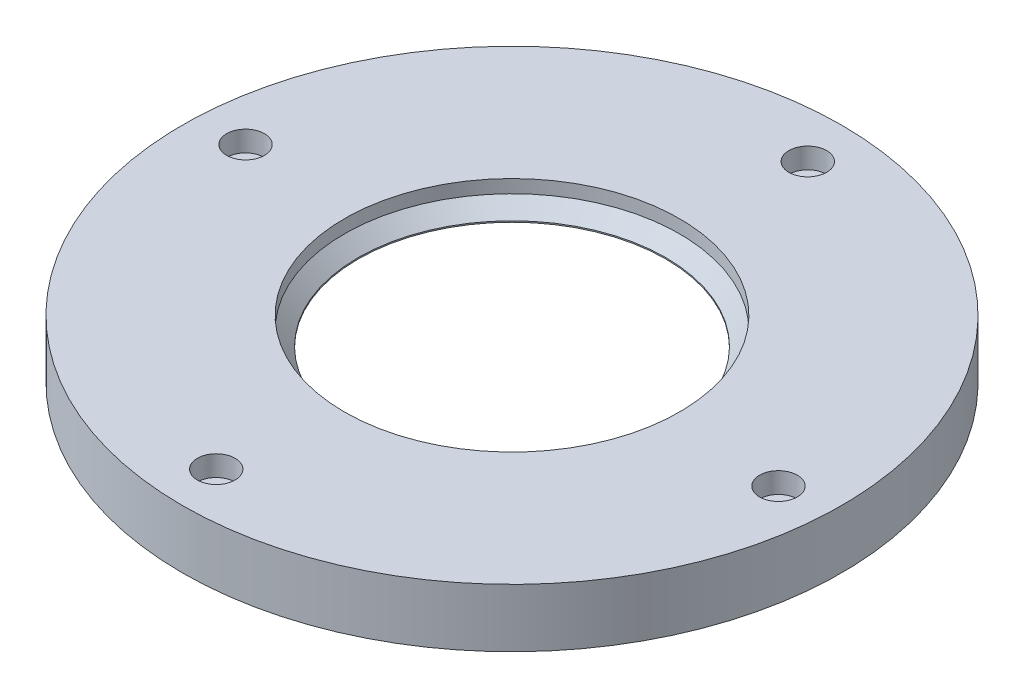
ISO-10303-21;
HEADER;
FILE_DESCRIPTION(('STEP AP214'),'2;1');
FILE_NAME('part.step','',(''),(''),'','','');
FILE_SCHEMA(('AUTOMOTIVE_DESIGN { 1 0 10303 214 1 1 1 1 }'));
ENDSEC;
DATA;
#1=APPLICATION_CONTEXT('core data for automotive mechanical design processes');
#2=APPLICATION_PROTOCOL_DEFINITION('international standard','automotive_design',2000,#1);
#3=PRODUCT_CONTEXT('',#1,'mechanical');
#4=PRODUCT('Part','Part','',(#3));
#5=PRODUCT_RELATED_PRODUCT_CATEGORY('part','',(#4));
#6=PRODUCT_DEFINITION_FORMATION('','',#4);
#7=PRODUCT_DEFINITION_CONTEXT('part definition',#1,'design');
#8=PRODUCT_DEFINITION('design','',#6,#7);
#9=PRODUCT_DEFINITION_SHAPE('','',#8);
#10=(LENGTH_UNIT() NAMED_UNIT(*) SI_UNIT(.MILLI.,.METRE.));
#11=(NAMED_UNIT(*) PLANE_ANGLE_UNIT() SI_UNIT($,.RADIAN.));
#12=(NAMED_UNIT(*) SI_UNIT($,.STERADIAN.) SOLID_ANGLE_UNIT());
#13=UNCERTAINTY_MEASURE_WITH_UNIT(LENGTH_MEASURE(1.E-05),#10,'distance_accuracy_value','');
#14=(GEOMETRIC_REPRESENTATION_CONTEXT(3) GLOBAL_UNCERTAINTY_ASSIGNED_CONTEXT((#13)) GLOBAL_UNIT_ASSIGNED_CONTEXT((#10,
#11,#12)) REPRESENTATION_CONTEXT('',''));
#15=CARTESIAN_POINT('',(0.,0.,0.));
#16=DIRECTION('',(0.,0.,1.));
#17=DIRECTION('',(1.,0.,0.));
#18=AXIS2_PLACEMENT_3D('',#15,#16,#17);
#19=CARTESIAN_POINT('',(0.,-35.1665110495205,0.));
#20=DIRECTION('',(0.,1.,0.));
#21=DIRECTION('',(0.,0.,1.));
#22=AXIS2_PLACEMENT_3D('',#19,#20,#21);
#23=CYLINDRICAL_SURFACE('',#22,25.6);
#24=CARTESIAN_POINT('',(0.,-44.6465868516727,0.));
#25=DIRECTION('',(0.,1.,0.));
#26=DIRECTION('',(0.,0.,1.));
#27=AXIS2_PLACEMENT_3D('',#24,#25,#26);
#28=CIRCLE('',#27,25.6);
#29=CARTESIAN_POINT('',(0.,-44.6465868516727,25.6));
#30=VERTEX_POINT('',#29);
#31=EDGE_CURVE('E44',#30,#30,#28,.T.);
#32=ORIENTED_EDGE('',*,*,#31,.T.);
#33=EDGE_LOOP('',(#32));
#34=FACE_BOUND('',#33,.T.);
#35=CARTESIAN_POINT('',(0.,-42.0465868516726,0.));
#36=DIRECTION('',(0.,1.,0.));
#37=DIRECTION('',(0.,0.,1.));
#38=AXIS2_PLACEMENT_3D('',#35,#36,#37);
#39=CIRCLE('',#38,25.6);
#40=CARTESIAN_POINT('',(0.,-42.0465868516726,25.6));
#41=VERTEX_POINT('',#40);
#42=EDGE_CURVE('E51',#41,#41,#39,.T.);
#43=ORIENTED_EDGE('',*,*,#42,.F.);
#44=EDGE_LOOP('',(#43));
#45=FACE_BOUND('',#44,.T.);
#46=ADVANCED_FACE('F31',(#34,#45),#23,.T.);
#47=CARTESIAN_POINT('',(-25.5652624017054,-44.6465868516727,-1.33317603186846));
#48=DIRECTION('',(0.,-1.,0.));
#49=DIRECTION('',(0.,0.,-1.));
#50=AXIS2_PLACEMENT_3D('',#47,#48,#49);
#51=PLANE('',#50);
#52=CARTESIAN_POINT('',(0.,-44.6465868516727,0.));
#53=DIRECTION('',(0.,1.,0.));
#54=DIRECTION('',(0.,0.,1.));
#55=AXIS2_PLACEMENT_3D('',#52,#53,#54);
#56=CIRCLE('',#55,22.4);
#57=CARTESIAN_POINT('',(0.,-44.6465868516727,22.4));
#58=VERTEX_POINT('',#57);
#59=EDGE_CURVE('E113',#58,#58,#56,.T.);
#60=ORIENTED_EDGE('',*,*,#59,.T.);
#61=EDGE_LOOP('',(#60));
#62=FACE_BOUND('',#61,.T.);
#63=ORIENTED_EDGE('',*,*,#31,.F.);
#64=EDGE_LOOP('',(#63));
#65=FACE_BOUND('',#64,.T.);
#66=ADVANCED_FACE('F120',(#62,#65),#51,.T.);
#67=CARTESIAN_POINT('',(0.,-35.1665110495205,0.));
#68=DIRECTION('',(0.,1.,0.));
#69=DIRECTION('',(0.,0.,1.));
#70=AXIS2_PLACEMENT_3D('',#67,#68,#69);
#71=CYLINDRICAL_SURFACE('',#70,22.4);
#72=CARTESIAN_POINT('',(0.,-44.4622722766219,0.));
#73=DIRECTION('',(0.,1.,0.));
#74=DIRECTION('',(0.,0.,1.));
#75=AXIS2_PLACEMENT_3D('',#72,#73,#74);
#76=CIRCLE('',#75,22.4);
#77=CARTESIAN_POINT('',(0.,-44.4622722766219,22.4));
#78=VERTEX_POINT('',#77);
#79=EDGE_CURVE('E110',#78,#78,#76,.T.);
#80=ORIENTED_EDGE('',*,*,#79,.T.);
#81=EDGE_LOOP('',(#80));
#82=FACE_BOUND('',#81,.T.);
#83=ORIENTED_EDGE('',*,*,#59,.F.);
#84=EDGE_LOOP('',(#83));
#85=FACE_BOUND('',#84,.T.);
#86=ADVANCED_FACE('F122',(#82,#85),#71,.F.);
#87=CARTESIAN_POINT('',(0.,-44.4622722766219,0.));
#88=DIRECTION('',(0.,1.,0.));
#89=DIRECTION('',(0.,0.,1.));
#90=AXIS2_PLACEMENT_3D('',#87,#88,#89);
#91=CONICAL_SURFACE('',#90,22.4,0.785398163397449);
#92=CARTESIAN_POINT('',(0.,-42.4622722766219,0.));
#93=DIRECTION('',(0.,1.,0.));
#94=DIRECTION('',(0.,0.,1.));
#95=AXIS2_PLACEMENT_3D('',#92,#93,#94);
#96=CIRCLE('',#95,24.4);
#97=CARTESIAN_POINT('',(0.,-42.4622722766219,24.4));
#98=VERTEX_POINT('',#97);
#99=EDGE_CURVE('E107',#98,#98,#96,.T.);
#100=ORIENTED_EDGE('',*,*,#99,.T.);
#101=EDGE_LOOP('',(#100));
#102=FACE_BOUND('',#101,.T.);
#103=ORIENTED_EDGE('',*,*,#79,.F.);
#104=EDGE_LOOP('',(#103));
#105=FACE_BOUND('',#104,.T.);
#106=ADVANCED_FACE('F129',(#102,#105),#91,.F.);
#107=CARTESIAN_POINT('',(0.,-35.1665110495205,0.));
#108=DIRECTION('',(0.,1.,0.));
#109=DIRECTION('',(0.,0.,1.));
#110=AXIS2_PLACEMENT_3D('',#107,#108,#109);
#111=CYLINDRICAL_SURFACE('',#110,24.4);
#112=CARTESIAN_POINT('',(0.,-40.5465868516726,0.));
#113=DIRECTION('',(0.,1.,0.));
#114=DIRECTION('',(0.,0.,1.));
#115=AXIS2_PLACEMENT_3D('',#112,#113,#114);
#116=CIRCLE('',#115,24.4);
#117=CARTESIAN_POINT('',(0.,-40.5465868516726,24.4));
#118=VERTEX_POINT('',#117);
#119=EDGE_CURVE('E104',#118,#118,#116,.T.);
#120=ORIENTED_EDGE('',*,*,#119,.T.);
#121=EDGE_LOOP('',(#120));
#122=FACE_BOUND('',#121,.T.);
#123=ORIENTED_EDGE('',*,*,#99,.F.);
#124=EDGE_LOOP('',(#123));
#125=FACE_BOUND('',#124,.T.);
#126=ADVANCED_FACE('F135',(#122,#125),#111,.F.);
#127=CARTESIAN_POINT('',(-24.3668907266255,-40.5465868516726,-1.27068340537463));
#128=DIRECTION('',(0.,1.,0.));
#129=DIRECTION('',(0.,0.,1.));
#130=AXIS2_PLACEMENT_3D('',#127,#128,#129);
#131=PLANE('',#130);
#132=CARTESIAN_POINT('',(2.13516473853934,-40.5465868516726,-40.9443655652313));
#133=DIRECTION('',(0.,1.,0.));
#134=DIRECTION('',(0.,0.,1.));
#135=AXIS2_PLACEMENT_3D('',#132,#133,#134);
#136=CIRCLE('',#135,2.75);
#137=CARTESIAN_POINT('',(2.13516473853934,-40.5465868516726,-38.1943655652313));
#138=VERTEX_POINT('',#137);
#139=EDGE_CURVE('E221',#138,#138,#136,.T.);
#140=ORIENTED_EDGE('',*,*,#139,.F.);
#141=EDGE_LOOP('',(#140));
#142=FACE_BOUND('',#141,.T.);
#143=CARTESIAN_POINT('',(40.9443655652313,-40.5465868516726,2.13516473853934));
#144=DIRECTION('',(0.,1.,0.));
#145=DIRECTION('',(0.,0.,1.));
#146=AXIS2_PLACEMENT_3D('',#143,#144,#145);
#147=CIRCLE('',#146,2.75);
#148=CARTESIAN_POINT('',(40.9443655652313,-40.5465868516726,4.88516473853933));
#149=VERTEX_POINT('',#148);
#150=EDGE_CURVE('E72',#149,#149,#147,.T.);
#151=ORIENTED_EDGE('',*,*,#150,.F.);
#152=EDGE_LOOP('',(#151));
#153=FACE_BOUND('',#152,.T.);
#154=CARTESIAN_POINT('',(-40.9443655652313,-40.5465868516726,-2.13516473853934));
#155=DIRECTION('',(0.,1.,0.));
#156=DIRECTION('',(0.,0.,1.));
#157=AXIS2_PLACEMENT_3D('',#154,#155,#156);
#158=CIRCLE('',#157,2.75);
#159=CARTESIAN_POINT('',(-40.9443655652313,-40.5465868516726,0.61483526146066));
#160=VERTEX_POINT('',#159);
#161=EDGE_CURVE('E59',#160,#160,#158,.T.);
#162=ORIENTED_EDGE('',*,*,#161,.F.);
#163=EDGE_LOOP('',(#162));
#164=FACE_BOUND('',#163,.T.);
#165=CARTESIAN_POINT('',(-2.13516473853933,-40.5465868516726,40.9443655652313));
#166=DIRECTION('',(0.,1.,0.));
#167=DIRECTION('',(0.,0.,1.));
#168=AXIS2_PLACEMENT_3D('',#165,#166,#167);
#169=CIRCLE('',#168,2.75);
#170=CARTESIAN_POINT('',(-2.13516473853933,-40.5465868516726,43.6943655652313));
#171=VERTEX_POINT('',#170);
#172=EDGE_CURVE('E55',#171,#171,#169,.T.);
#173=ORIENTED_EDGE('',*,*,#172,.F.);
#174=EDGE_LOOP('',(#173));
#175=FACE_BOUND('',#174,.T.);
#176=CARTESIAN_POINT('',(0.,-40.5465868516726,0.));
#177=DIRECTION('',(0.,1.,0.));
#178=DIRECTION('',(0.,0.,1.));
#179=AXIS2_PLACEMENT_3D('',#176,#177,#178);
#180=CIRCLE('',#179,48.);
#181=CARTESIAN_POINT('',(0.,-40.5465868516726,48.));
#182=VERTEX_POINT('',#181);
#183=EDGE_CURVE('E101',#182,#182,#180,.T.);
#184=ORIENTED_EDGE('',*,*,#183,.T.);
#185=EDGE_LOOP('',(#184));
#186=FACE_BOUND('',#185,.T.);
#187=ORIENTED_EDGE('',*,*,#119,.F.);
#188=EDGE_LOOP('',(#187));
#189=FACE_BOUND('',#188,.T.);
#190=ADVANCED_FACE('F139',(#142,#153,#164,#175,#186,#189),#131,.T.);
#191=CARTESIAN_POINT('',(0.,-35.1665110495205,0.));
#192=DIRECTION('',(0.,1.,0.));
#193=DIRECTION('',(0.,0.,1.));
#194=AXIS2_PLACEMENT_3D('',#191,#192,#193);
#195=CYLINDRICAL_SURFACE('',#194,48.);
#196=CARTESIAN_POINT('',(0.,-49.0465868516726,0.));
#197=DIRECTION('',(0.,1.,0.));
#198=DIRECTION('',(0.,0.,1.));
#199=AXIS2_PLACEMENT_3D('',#196,#197,#198);
#200=CIRCLE('',#199,48.);
#201=CARTESIAN_POINT('',(0.,-49.0465868516726,48.));
#202=VERTEX_POINT('',#201);
#203=EDGE_CURVE('E98',#202,#202,#200,.T.);
#204=ORIENTED_EDGE('',*,*,#203,.T.);
#205=EDGE_LOOP('',(#204));
#206=FACE_BOUND('',#205,.T.);
#207=ORIENTED_EDGE('',*,*,#183,.F.);
#208=EDGE_LOOP('',(#207));
#209=FACE_BOUND('',#208,.T.);
#210=ADVANCED_FACE('F143',(#206,#209),#195,.T.);
#211=CARTESIAN_POINT('',(-47.9348670031976,-49.0465868516726,-2.49970505975337));
#212=DIRECTION('',(0.,-1.,0.));
#213=DIRECTION('',(0.,0.,-1.));
#214=AXIS2_PLACEMENT_3D('',#211,#212,#213);
#215=PLANE('',#214);
#216=CARTESIAN_POINT('',(2.13516473853934,-49.0465868516726,-40.9443655652313));
#217=DIRECTION('',(0.,-1.,0.));
#218=DIRECTION('',(0.,0.,-1.));
#219=AXIS2_PLACEMENT_3D('',#216,#217,#218);
#220=CIRCLE('',#219,1.45);
#221=CARTESIAN_POINT('',(2.13516473853934,-49.0465868516726,-42.3943655652313));
#222=VERTEX_POINT('',#221);
#223=EDGE_CURVE('E35',#222,#222,#220,.T.);
#224=ORIENTED_EDGE('',*,*,#223,.F.);
#225=EDGE_LOOP('',(#224));
#226=FACE_BOUND('',#225,.T.);
#227=CARTESIAN_POINT('',(40.9443655652313,-49.0465868516726,2.13516473853934));
#228=DIRECTION('',(0.,-1.,0.));
#229=DIRECTION('',(0.,0.,-1.));
#230=AXIS2_PLACEMENT_3D('',#227,#228,#229);
#231=CIRCLE('',#230,1.45);
#232=CARTESIAN_POINT('',(40.9443655652313,-49.0465868516726,0.685164738539336));
#233=VERTEX_POINT('',#232);
#234=EDGE_CURVE('E57',#233,#233,#231,.T.);
#235=ORIENTED_EDGE('',*,*,#234,.F.);
#236=EDGE_LOOP('',(#235));
#237=FACE_BOUND('',#236,.T.);
#238=CARTESIAN_POINT('',(-40.9443655652313,-49.0465868516726,-2.13516473853934));
#239=DIRECTION('',(0.,-1.,0.));
#240=DIRECTION('',(0.,0.,-1.));
#241=AXIS2_PLACEMENT_3D('',#238,#239,#240);
#242=CIRCLE('',#241,1.45);
#243=CARTESIAN_POINT('',(-40.9443655652313,-49.0465868516726,-3.58516473853934));
#244=VERTEX_POINT('',#243);
#245=EDGE_CURVE('E53',#244,#244,#242,.T.);
#246=ORIENTED_EDGE('',*,*,#245,.F.);
#247=EDGE_LOOP('',(#246));
#248=FACE_BOUND('',#247,.T.);
#249=CARTESIAN_POINT('',(-2.13516473853933,-49.0465868516726,40.9443655652313));
#250=DIRECTION('',(0.,-1.,0.));
#251=DIRECTION('',(0.,0.,-1.));
#252=AXIS2_PLACEMENT_3D('',#249,#250,#251);
#253=CIRCLE('',#252,1.45);
#254=CARTESIAN_POINT('',(-2.13516473853933,-49.0465868516726,39.4943655652313));
#255=VERTEX_POINT('',#254);
#256=EDGE_CURVE('E48',#255,#255,#253,.T.);
#257=ORIENTED_EDGE('',*,*,#256,.F.);
#258=EDGE_LOOP('',(#257));
#259=FACE_BOUND('',#258,.T.);
#260=CARTESIAN_POINT('',(0.,-49.0465868516726,0.));
#261=DIRECTION('',(0.,1.,0.));
#262=DIRECTION('',(0.,0.,1.));
#263=AXIS2_PLACEMENT_3D('',#260,#261,#262);
#264=CIRCLE('',#263,33.9999999999755);
#265=CARTESIAN_POINT('',(0.,-49.0465868516726,33.9999999999755));
#266=VERTEX_POINT('',#265);
#267=EDGE_CURVE('E95',#266,#266,#264,.T.);
#268=ORIENTED_EDGE('',*,*,#267,.T.);
#269=EDGE_LOOP('',(#268));
#270=FACE_BOUND('',#269,.T.);
#271=ORIENTED_EDGE('',*,*,#203,.F.);
#272=EDGE_LOOP('',(#271));
#273=FACE_BOUND('',#272,.T.);
#274=ADVANCED_FACE('F147',(#226,#237,#248,#259,#270,#273),#215,.T.);
#275=CARTESIAN_POINT('',(0.,-35.1665110495205,0.));
#276=DIRECTION('',(0.,1.,0.));
#277=DIRECTION('',(0.,0.,1.));
#278=AXIS2_PLACEMENT_3D('',#275,#276,#277);
#279=CYLINDRICAL_SURFACE('',#278,33.9999999999755);
#280=CARTESIAN_POINT('',(0.,-48.0465868516726,0.));
#281=DIRECTION('',(0.,-1.,0.));
#282=DIRECTION('',(0.,0.,-1.));
#283=AXIS2_PLACEMENT_3D('',#280,#281,#282);
#284=CIRCLE('',#283,33.9999999999755);
#285=CARTESIAN_POINT('',(0.,-48.0465868516726,-33.9999999999755));
#286=VERTEX_POINT('',#285);
#287=EDGE_CURVE('E39',#286,#286,#284,.F.);
#288=ORIENTED_EDGE('',*,*,#287,.T.);
#289=EDGE_LOOP('',(#288));
#290=FACE_BOUND('',#289,.T.);
#291=ORIENTED_EDGE('',*,*,#267,.F.);
#292=EDGE_LOOP('',(#291));
#293=FACE_BOUND('',#292,.T.);
#294=ADVANCED_FACE('F151',(#290,#293),#279,.F.);
#295=CARTESIAN_POINT('',(-33.9538641272405,-47.0465868516726,-1.77062441732403));
#296=DIRECTION('',(0.,-1.,0.));
#297=DIRECTION('',(0.,0.,-1.));
#298=AXIS2_PLACEMENT_3D('',#295,#296,#297);
#299=PLANE('',#298);
#300=CARTESIAN_POINT('',(0.,-47.0465868516726,0.));
#301=DIRECTION('',(0.,-1.,0.));
#302=DIRECTION('',(0.,0.,-1.));
#303=AXIS2_PLACEMENT_3D('',#300,#301,#302);
#304=CIRCLE('',#303,32.9999999999755);
#305=CARTESIAN_POINT('',(0.,-47.0465868516726,-32.9999999999755));
#306=VERTEX_POINT('',#305);
#307=EDGE_CURVE('E10',#306,#306,#304,.T.);
#308=ORIENTED_EDGE('',*,*,#307,.T.);
#309=EDGE_LOOP('',(#308));
#310=FACE_BOUND('',#309,.T.);
#311=CARTESIAN_POINT('',(0.,-47.0465868516726,0.));
#312=DIRECTION('',(0.,1.,0.));
#313=DIRECTION('',(0.,0.,1.));
#314=AXIS2_PLACEMENT_3D('',#311,#312,#313);
#315=CIRCLE('',#314,27.9);
#316=CARTESIAN_POINT('',(0.,-47.0465868516726,27.9));
#317=VERTEX_POINT('',#316);
#318=EDGE_CURVE('E92',#317,#317,#315,.T.);
#319=ORIENTED_EDGE('',*,*,#318,.T.);
#320=EDGE_LOOP('',(#319));
#321=FACE_BOUND('',#320,.T.);
#322=ADVANCED_FACE('F155',(#310,#321),#299,.T.);
#323=CARTESIAN_POINT('',(0.,-35.1665110495205,0.));
#324=DIRECTION('',(0.,1.,0.));
#325=DIRECTION('',(0.,0.,1.));
#326=AXIS2_PLACEMENT_3D('',#323,#324,#325);
#327=CYLINDRICAL_SURFACE('',#326,27.9);
#328=CARTESIAN_POINT('',(0.,-42.0465868516726,0.));
#329=DIRECTION('',(0.,1.,0.));
#330=DIRECTION('',(0.,0.,1.));
#331=AXIS2_PLACEMENT_3D('',#328,#329,#330);
#332=CIRCLE('',#331,27.9);
#333=CARTESIAN_POINT('',(0.,-42.0465868516726,27.9));
#334=VERTEX_POINT('',#333);
#335=EDGE_CURVE('E89',#334,#334,#332,.T.);
#336=ORIENTED_EDGE('',*,*,#335,.T.);
#337=EDGE_LOOP('',(#336));
#338=FACE_BOUND('',#337,.T.);
#339=ORIENTED_EDGE('',*,*,#318,.F.);
#340=EDGE_LOOP('',(#339));
#341=FACE_BOUND('',#340,.T.);
#342=ADVANCED_FACE('F159',(#338,#341),#327,.F.);
#343=CARTESIAN_POINT('',(-27.8621414456086,-42.0465868516726,-1.45295356598164));
#344=DIRECTION('',(0.,-1.,0.));
#345=DIRECTION('',(0.,0.,-1.));
#346=AXIS2_PLACEMENT_3D('',#343,#344,#345);
#347=PLANE('',#346);
#348=ORIENTED_EDGE('',*,*,#42,.T.);
#349=EDGE_LOOP('',(#348));
#350=FACE_BOUND('',#349,.T.);
#351=ORIENTED_EDGE('',*,*,#335,.F.);
#352=EDGE_LOOP('',(#351));
#353=FACE_BOUND('',#352,.T.);
#354=ADVANCED_FACE('F162',(#350,#353),#347,.T.);
#355=CARTESIAN_POINT('',(0.,-48.0465868516726,0.));
#356=DIRECTION('',(0.,-1.,0.));
#357=DIRECTION('',(0.,0.,-1.));
#358=AXIS2_PLACEMENT_3D('',#355,#356,#357);
#359=TOROIDAL_SURFACE('',#358,32.9999999999755,1.);
#360=ORIENTED_EDGE('',*,*,#307,.F.);
#361=EDGE_LOOP('',(#360));
#362=FACE_BOUND('',#361,.T.);
#363=ORIENTED_EDGE('',*,*,#287,.F.);
#364=EDGE_LOOP('',(#363));
#365=FACE_BOUND('',#364,.T.);
#366=ADVANCED_FACE('F33',(#362,#365),#359,.F.);
#367=CARTESIAN_POINT('',(-2.13516473853933,-40.5465868516726,40.9443655652313));
#368=DIRECTION('',(0.,1.,0.));
#369=DIRECTION('',(0.,0.,1.));
#370=AXIS2_PLACEMENT_3D('',#367,#368,#369);
#371=CYLINDRICAL_SURFACE('',#370,1.45);
#372=ORIENTED_EDGE('',*,*,#256,.T.);
#373=EDGE_LOOP('',(#372));
#374=FACE_BOUND('',#373,.T.);
#375=CARTESIAN_POINT('',(-2.13516473853933,-43.5465868516726,40.9443655652313));
#376=DIRECTION('',(0.,1.,0.));
#377=DIRECTION('',(0.,0.,1.));
#378=AXIS2_PLACEMENT_3D('',#375,#376,#377);
#379=CIRCLE('',#378,1.45);
#380=CARTESIAN_POINT('',(-2.13516473853933,-43.5465868516726,42.3943655652313));
#381=VERTEX_POINT('',#380);
#382=EDGE_CURVE('E52',#381,#381,#379,.T.);
#383=ORIENTED_EDGE('',*,*,#382,.T.);
#384=EDGE_LOOP('',(#383));
#385=FACE_BOUND('',#384,.T.);
#386=ADVANCED_FACE('F167',(#374,#385),#371,.F.);
#387=CARTESIAN_POINT('',(-0.685164738539334,-43.5465868516726,40.9443655652313));
#388=DIRECTION('',(0.,-1.,0.));
#389=DIRECTION('',(0.,0.,-1.));
#390=AXIS2_PLACEMENT_3D('',#387,#388,#389);
#391=PLANE('',#390);
#392=ORIENTED_EDGE('',*,*,#382,.F.);
#393=EDGE_LOOP('',(#392));
#394=FACE_BOUND('',#393,.T.);
#395=CARTESIAN_POINT('',(-2.13516473853933,-43.5465868516726,40.9443655652313));
#396=DIRECTION('',(0.,1.,0.));
#397=DIRECTION('',(0.,0.,1.));
#398=AXIS2_PLACEMENT_3D('',#395,#396,#397);
#399=CIRCLE('',#398,2.75);
#400=CARTESIAN_POINT('',(-2.13516473853933,-43.5465868516726,43.6943655652313));
#401=VERTEX_POINT('',#400);
#402=EDGE_CURVE('E82',#401,#401,#399,.T.);
#403=ORIENTED_EDGE('',*,*,#402,.T.);
#404=EDGE_LOOP('',(#403));
#405=FACE_BOUND('',#404,.T.);
#406=ADVANCED_FACE('F170',(#394,#405),#391,.F.);
#407=CARTESIAN_POINT('',(-2.13516473853933,-40.5465868516726,40.9443655652313));
#408=DIRECTION('',(0.,1.,0.));
#409=DIRECTION('',(0.,0.,1.));
#410=AXIS2_PLACEMENT_3D('',#407,#408,#409);
#411=CYLINDRICAL_SURFACE('',#410,2.75);
#412=ORIENTED_EDGE('',*,*,#402,.F.);
#413=EDGE_LOOP('',(#412));
#414=FACE_BOUND('',#413,.T.);
#415=ORIENTED_EDGE('',*,*,#172,.T.);
#416=EDGE_LOOP('',(#415));
#417=FACE_BOUND('',#416,.T.);
#418=ADVANCED_FACE('F174',(#414,#417),#411,.F.);
#419=CARTESIAN_POINT('',(-40.9443655652313,-40.5465868516726,-2.13516473853934));
#420=DIRECTION('',(0.,1.,0.));
#421=DIRECTION('',(0.,0.,1.));
#422=AXIS2_PLACEMENT_3D('',#419,#420,#421);
#423=CYLINDRICAL_SURFACE('',#422,1.45);
#424=ORIENTED_EDGE('',*,*,#245,.T.);
#425=EDGE_LOOP('',(#424));
#426=FACE_BOUND('',#425,.T.);
#427=CARTESIAN_POINT('',(-40.9443655652313,-43.5465868516726,-2.13516473853934));
#428=DIRECTION('',(0.,1.,0.));
#429=DIRECTION('',(0.,0.,1.));
#430=AXIS2_PLACEMENT_3D('',#427,#428,#429);
#431=CIRCLE('',#430,1.45);
#432=CARTESIAN_POINT('',(-40.9443655652313,-43.5465868516726,-0.685164738539335));
#433=VERTEX_POINT('',#432);
#434=EDGE_CURVE('E56',#433,#433,#431,.T.);
#435=ORIENTED_EDGE('',*,*,#434,.T.);
#436=EDGE_LOOP('',(#435));
#437=FACE_BOUND('',#436,.T.);
#438=ADVANCED_FACE('F178',(#426,#437),#423,.F.);
#439=CARTESIAN_POINT('',(-39.4943655652313,-43.5465868516726,-2.13516473853934));
#440=DIRECTION('',(0.,-1.,0.));
#441=DIRECTION('',(0.,0.,-1.));
#442=AXIS2_PLACEMENT_3D('',#439,#440,#441);
#443=PLANE('',#442);
#444=ORIENTED_EDGE('',*,*,#434,.F.);
#445=EDGE_LOOP('',(#444));
#446=FACE_BOUND('',#445,.T.);
#447=CARTESIAN_POINT('',(-40.9443655652313,-43.5465868516726,-2.13516473853934));
#448=DIRECTION('',(0.,1.,0.));
#449=DIRECTION('',(0.,0.,1.));
#450=AXIS2_PLACEMENT_3D('',#447,#448,#449);
#451=CIRCLE('',#450,2.75);
#452=CARTESIAN_POINT('',(-40.9443655652313,-43.5465868516726,0.61483526146066));
#453=VERTEX_POINT('',#452);
#454=EDGE_CURVE('E64',#453,#453,#451,.T.);
#455=ORIENTED_EDGE('',*,*,#454,.T.);
#456=EDGE_LOOP('',(#455));
#457=FACE_BOUND('',#456,.T.);
#458=ADVANCED_FACE('F182',(#446,#457),#443,.F.);
#459=CARTESIAN_POINT('',(-40.9443655652313,-40.5465868516726,-2.13516473853934));
#460=DIRECTION('',(0.,1.,0.));
#461=DIRECTION('',(0.,0.,1.));
#462=AXIS2_PLACEMENT_3D('',#459,#460,#461);
#463=CYLINDRICAL_SURFACE('',#462,2.75);
#464=ORIENTED_EDGE('',*,*,#454,.F.);
#465=EDGE_LOOP('',(#464));
#466=FACE_BOUND('',#465,.T.);
#467=ORIENTED_EDGE('',*,*,#161,.T.);
#468=EDGE_LOOP('',(#467));
#469=FACE_BOUND('',#468,.T.);
#470=ADVANCED_FACE('F186',(#466,#469),#463,.F.);
#471=CARTESIAN_POINT('',(40.9443655652313,-40.5465868516726,2.13516473853934));
#472=DIRECTION('',(0.,1.,0.));
#473=DIRECTION('',(0.,0.,1.));
#474=AXIS2_PLACEMENT_3D('',#471,#472,#473);
#475=CYLINDRICAL_SURFACE('',#474,1.45);
#476=ORIENTED_EDGE('',*,*,#234,.T.);
#477=EDGE_LOOP('',(#476));
#478=FACE_BOUND('',#477,.T.);
#479=CARTESIAN_POINT('',(40.9443655652313,-43.5465868516726,2.13516473853934));
#480=DIRECTION('',(0.,1.,0.));
#481=DIRECTION('',(0.,0.,1.));
#482=AXIS2_PLACEMENT_3D('',#479,#480,#481);
#483=CIRCLE('',#482,1.45);
#484=CARTESIAN_POINT('',(40.9443655652313,-43.5465868516726,3.58516473853934));
#485=VERTEX_POINT('',#484);
#486=EDGE_CURVE('E60',#485,#485,#483,.T.);
#487=ORIENTED_EDGE('',*,*,#486,.T.);
#488=EDGE_LOOP('',(#487));
#489=FACE_BOUND('',#488,.T.);
#490=ADVANCED_FACE('F190',(#478,#489),#475,.F.);
#491=CARTESIAN_POINT('',(42.3943655652313,-43.5465868516726,2.13516473853934));
#492=DIRECTION('',(0.,-1.,0.));
#493=DIRECTION('',(0.,0.,-1.));
#494=AXIS2_PLACEMENT_3D('',#491,#492,#493);
#495=PLANE('',#494);
#496=ORIENTED_EDGE('',*,*,#486,.F.);
#497=EDGE_LOOP('',(#496));
#498=FACE_BOUND('',#497,.T.);
#499=CARTESIAN_POINT('',(40.9443655652313,-43.5465868516726,2.13516473853934));
#500=DIRECTION('',(0.,1.,0.));
#501=DIRECTION('',(0.,0.,1.));
#502=AXIS2_PLACEMENT_3D('',#499,#500,#501);
#503=CIRCLE('',#502,2.75);
#504=CARTESIAN_POINT('',(40.9443655652313,-43.5465868516726,4.88516473853933));
#505=VERTEX_POINT('',#504);
#506=EDGE_CURVE('E67',#505,#505,#503,.T.);
#507=ORIENTED_EDGE('',*,*,#506,.T.);
#508=EDGE_LOOP('',(#507));
#509=FACE_BOUND('',#508,.T.);
#510=ADVANCED_FACE('F194',(#498,#509),#495,.F.);
#511=CARTESIAN_POINT('',(40.9443655652313,-40.5465868516726,2.13516473853934));
#512=DIRECTION('',(0.,1.,0.));
#513=DIRECTION('',(0.,0.,1.));
#514=AXIS2_PLACEMENT_3D('',#511,#512,#513);
#515=CYLINDRICAL_SURFACE('',#514,2.75);
#516=ORIENTED_EDGE('',*,*,#506,.F.);
#517=EDGE_LOOP('',(#516));
#518=FACE_BOUND('',#517,.T.);
#519=ORIENTED_EDGE('',*,*,#150,.T.);
#520=EDGE_LOOP('',(#519));
#521=FACE_BOUND('',#520,.T.);
#522=ADVANCED_FACE('F197',(#518,#521),#515,.F.);
#523=CARTESIAN_POINT('',(2.13516473853934,-40.5465868516726,-40.9443655652313));
#524=DIRECTION('',(0.,1.,0.));
#525=DIRECTION('',(0.,0.,1.));
#526=AXIS2_PLACEMENT_3D('',#523,#524,#525);
#527=CYLINDRICAL_SURFACE('',#526,1.45);
#528=ORIENTED_EDGE('',*,*,#223,.T.);
#529=EDGE_LOOP('',(#528));
#530=FACE_BOUND('',#529,.T.);
#531=CARTESIAN_POINT('',(2.13516473853934,-43.5465868516726,-40.9443655652313));
#532=DIRECTION('',(0.,1.,0.));
#533=DIRECTION('',(0.,0.,1.));
#534=AXIS2_PLACEMENT_3D('',#531,#532,#533);
#535=CIRCLE('',#534,1.45);
#536=CARTESIAN_POINT('',(2.13516473853934,-43.5465868516726,-39.4943655652313));
#537=VERTEX_POINT('',#536);
#538=EDGE_CURVE('E223',#537,#537,#535,.T.);
#539=ORIENTED_EDGE('',*,*,#538,.T.);
#540=EDGE_LOOP('',(#539));
#541=FACE_BOUND('',#540,.T.);
#542=ADVANCED_FACE('F201',(#530,#541),#527,.F.);
#543=CARTESIAN_POINT('',(3.58516473853934,-43.5465868516726,-40.9443655652313));
#544=DIRECTION('',(0.,-1.,0.));
#545=DIRECTION('',(0.,0.,-1.));
#546=AXIS2_PLACEMENT_3D('',#543,#544,#545);
#547=PLANE('',#546);
#548=ORIENTED_EDGE('',*,*,#538,.F.);
#549=EDGE_LOOP('',(#548));
#550=FACE_BOUND('',#549,.T.);
#551=CARTESIAN_POINT('',(2.13516473853934,-43.5465868516726,-40.9443655652313));
#552=DIRECTION('',(0.,1.,0.));
#553=DIRECTION('',(0.,0.,1.));
#554=AXIS2_PLACEMENT_3D('',#551,#552,#553);
#555=CIRCLE('',#554,2.75);
#556=CARTESIAN_POINT('',(2.13516473853934,-43.5465868516726,-38.1943655652313));
#557=VERTEX_POINT('',#556);
#558=EDGE_CURVE('E218',#557,#557,#555,.T.);
#559=ORIENTED_EDGE('',*,*,#558,.T.);
#560=EDGE_LOOP('',(#559));
#561=FACE_BOUND('',#560,.T.);
#562=ADVANCED_FACE('F205',(#550,#561),#547,.F.);
#563=CARTESIAN_POINT('',(2.13516473853934,-40.5465868516726,-40.9443655652313));
#564=DIRECTION('',(0.,1.,0.));
#565=DIRECTION('',(0.,0.,1.));
#566=AXIS2_PLACEMENT_3D('',#563,#564,#565);
#567=CYLINDRICAL_SURFACE('',#566,2.75);
#568=ORIENTED_EDGE('',*,*,#558,.F.);
#569=EDGE_LOOP('',(#568));
#570=FACE_BOUND('',#569,.T.);
#571=ORIENTED_EDGE('',*,*,#139,.T.);
#572=EDGE_LOOP('',(#571));
#573=FACE_BOUND('',#572,.T.);
#574=ADVANCED_FACE('F209',(#570,#573),#567,.F.);
#575=CLOSED_SHELL('',(#46,#66,#86,#106,#126,#190,#210,#274,#294,#322,#342,#354,#366,#386,#406,
#418,#438,#458,#470,#490,#510,#522,#542,#562,#574));
#576=MANIFOLD_SOLID_BREP('B2',#575);
#577=ADVANCED_BREP_SHAPE_REPRESENTATION('',(#18,#576),#14);
#578=SHAPE_DEFINITION_REPRESENTATION(#9,#577);
ENDSEC;
END-ISO-10303-21;
